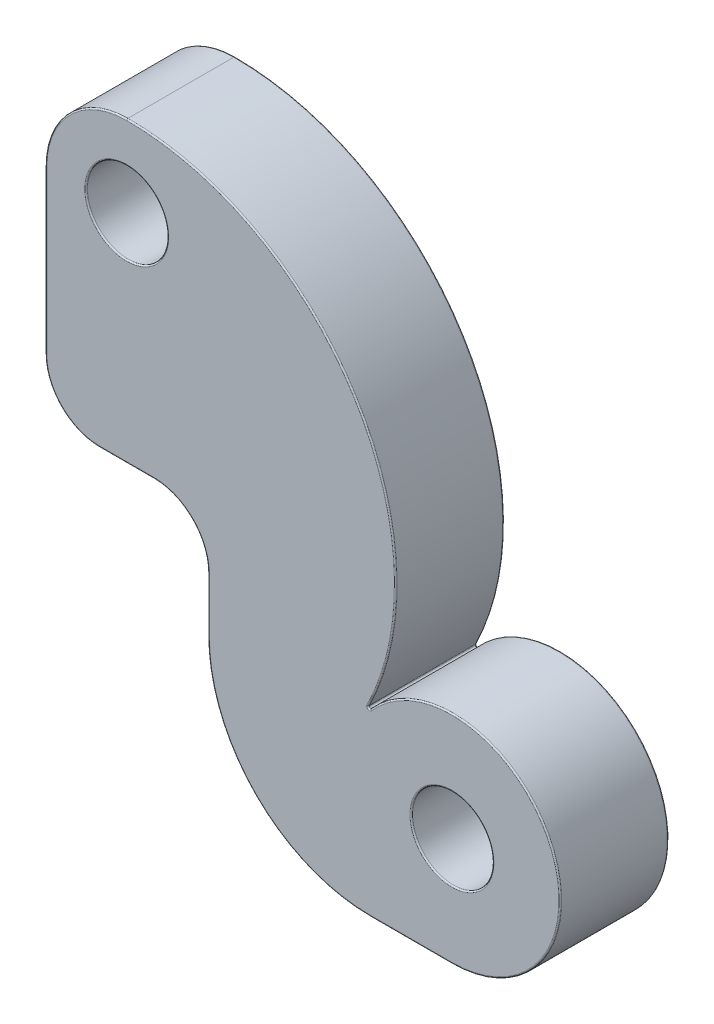
ISO-10303-21;
HEADER;
FILE_DESCRIPTION(('STEP AP214'),'2;1');
FILE_NAME('part.step','',(''),(''),'','','');
FILE_SCHEMA(('AUTOMOTIVE_DESIGN { 1 0 10303 214 1 1 1 1 }'));
ENDSEC;
DATA;
#1=APPLICATION_CONTEXT('core data for automotive mechanical design processes');
#2=APPLICATION_PROTOCOL_DEFINITION('international standard','automotive_design',2000,#1);
#3=PRODUCT_CONTEXT('',#1,'mechanical');
#4=PRODUCT('Part','Part','',(#3));
#5=PRODUCT_RELATED_PRODUCT_CATEGORY('part','',(#4));
#6=PRODUCT_DEFINITION_FORMATION('','',#4);
#7=PRODUCT_DEFINITION_CONTEXT('part definition',#1,'design');
#8=PRODUCT_DEFINITION('design','',#6,#7);
#9=PRODUCT_DEFINITION_SHAPE('','',#8);
#10=(LENGTH_UNIT() NAMED_UNIT(*) SI_UNIT(.MILLI.,.METRE.));
#11=(NAMED_UNIT(*) PLANE_ANGLE_UNIT() SI_UNIT($,.RADIAN.));
#12=(NAMED_UNIT(*) SI_UNIT($,.STERADIAN.) SOLID_ANGLE_UNIT());
#13=UNCERTAINTY_MEASURE_WITH_UNIT(LENGTH_MEASURE(1.E-05),#10,'distance_accuracy_value','');
#14=(GEOMETRIC_REPRESENTATION_CONTEXT(3) GLOBAL_UNCERTAINTY_ASSIGNED_CONTEXT((#13)) GLOBAL_UNIT_ASSIGNED_CONTEXT((#10,
#11,#12)) REPRESENTATION_CONTEXT('',''));
#15=CARTESIAN_POINT('',(0.,0.,0.));
#16=DIRECTION('',(0.,0.,1.));
#17=DIRECTION('',(1.,0.,0.));
#18=AXIS2_PLACEMENT_3D('',#15,#16,#17);
#19=CARTESIAN_POINT('',(0.,0.,20.));
#20=DIRECTION('',(0.,0.,1.));
#21=DIRECTION('',(1.,0.,0.));
#22=AXIS2_PLACEMENT_3D('',#19,#20,#21);
#23=PLANE('',#22);
#24=CARTESIAN_POINT('',(60.,-70.,20.));
#25=DIRECTION('',(0.,0.,1.));
#26=DIRECTION('',(1.,0.,0.));
#27=AXIS2_PLACEMENT_3D('',#24,#25,#26);
#28=CIRCLE('',#27,7.75000000000001);
#29=CARTESIAN_POINT('',(67.75,-70.,20.));
#30=VERTEX_POINT('',#29);
#31=EDGE_CURVE('E394',#30,#30,#28,.F.);
#32=ORIENTED_EDGE('',*,*,#31,.T.);
#33=EDGE_LOOP('',(#32));
#34=FACE_BOUND('',#33,.T.);
#35=CARTESIAN_POINT('',(0.,0.,20.));
#36=DIRECTION('',(0.,0.,1.));
#37=DIRECTION('',(1.,0.,0.));
#38=AXIS2_PLACEMENT_3D('',#35,#36,#37);
#39=CIRCLE('',#38,7.75);
#40=CARTESIAN_POINT('',(7.75,0.,20.));
#41=VERTEX_POINT('',#40);
#42=EDGE_CURVE('E390',#41,#41,#39,.F.);
#43=ORIENTED_EDGE('',*,*,#42,.T.);
#44=EDGE_LOOP('',(#43));
#45=FACE_BOUND('',#44,.T.);
#46=CARTESIAN_POINT('',(60.,-70.,20.));
#47=DIRECTION('',(0.,0.,1.));
#48=DIRECTION('',(1.,0.,0.));
#49=AXIS2_PLACEMENT_3D('',#46,#47,#48);
#50=CIRCLE('',#49,19.75);
#51=CARTESIAN_POINT('',(60.,-89.75,20.));
#52=VERTEX_POINT('',#51);
#53=CARTESIAN_POINT('',(45.1570433548488,-56.9712188586131,20.));
#54=VERTEX_POINT('',#53);
#55=EDGE_CURVE('E235',#52,#54,#50,.T.);
#56=ORIENTED_EDGE('',*,*,#55,.T.);
#57=CARTESIAN_POINT('',(44.7812723005411,-56.6413762980716,20.));
#58=DIRECTION('',(0.,0.,1.));
#59=DIRECTION('',(1.,0.,0.));
#60=AXIS2_PLACEMENT_3D('',#57,#58,#59);
#61=CIRCLE('',#60,0.5);
#62=CARTESIAN_POINT('',(44.3324979181449,-56.4209186973751,20.));
#63=VERTEX_POINT('',#62);
#64=EDGE_CURVE('E11',#54,#63,#61,.F.);
#65=ORIENTED_EDGE('',*,*,#64,.T.);
#66=CARTESIAN_POINT('',(0.,-34.6428571428571,20.));
#67=DIRECTION('',(0.,0.,1.));
#68=DIRECTION('',(1.,0.,0.));
#69=AXIS2_PLACEMENT_3D('',#66,#67,#68);
#70=CIRCLE('',#69,49.3928571428571);
#71=CARTESIAN_POINT('',(0.,14.75,20.));
#72=VERTEX_POINT('',#71);
#73=EDGE_CURVE('E360',#63,#72,#70,.T.);
#74=ORIENTED_EDGE('',*,*,#73,.T.);
#75=CARTESIAN_POINT('',(0.,0.,20.));
#76=DIRECTION('',(0.,0.,1.));
#77=DIRECTION('',(1.,0.,0.));
#78=AXIS2_PLACEMENT_3D('',#75,#76,#77);
#79=CIRCLE('',#78,14.75);
#80=CARTESIAN_POINT('',(-14.75,0.,20.));
#81=VERTEX_POINT('',#80);
#82=EDGE_CURVE('E363',#72,#81,#79,.T.);
#83=ORIENTED_EDGE('',*,*,#82,.T.);
#84=DIRECTION('',(0.,-1.,0.));
#85=VECTOR('',#84,1.);
#86=CARTESIAN_POINT('',(-14.75,-29.9999999999999,20.));
#87=LINE('',#86,#85);
#88=CARTESIAN_POINT('',(-14.75,-29.9999999999999,20.));
#89=VERTEX_POINT('',#88);
#90=EDGE_CURVE('E367',#81,#89,#87,.T.);
#91=ORIENTED_EDGE('',*,*,#90,.T.);
#92=CARTESIAN_POINT('',(-5.,-30.,20.));
#93=DIRECTION('',(0.,0.,1.));
#94=DIRECTION('',(1.,0.,0.));
#95=AXIS2_PLACEMENT_3D('',#92,#93,#94);
#96=CIRCLE('',#95,9.75);
#97=CARTESIAN_POINT('',(-4.99999999999993,-39.75,20.));
#98=VERTEX_POINT('',#97);
#99=EDGE_CURVE('E370',#89,#98,#96,.T.);
#100=ORIENTED_EDGE('',*,*,#99,.T.);
#101=DIRECTION('',(1.,0.,0.));
#102=VECTOR('',#101,1.);
#103=CARTESIAN_POINT('',(4.99999999999994,-39.75,20.));
#104=LINE('',#103,#102);
#105=CARTESIAN_POINT('',(4.99999999999994,-39.75,20.));
#106=VERTEX_POINT('',#105);
#107=EDGE_CURVE('E373',#98,#106,#104,.T.);
#108=ORIENTED_EDGE('',*,*,#107,.T.);
#109=CARTESIAN_POINT('',(5.00000000000001,-50.,20.));
#110=DIRECTION('',(0.,0.,1.));
#111=DIRECTION('',(1.,0.,0.));
#112=AXIS2_PLACEMENT_3D('',#109,#110,#111);
#113=CIRCLE('',#112,10.25);
#114=CARTESIAN_POINT('',(15.25,-50.0000000000001,20.));
#115=VERTEX_POINT('',#114);
#116=EDGE_CURVE('E376',#106,#115,#113,.F.);
#117=ORIENTED_EDGE('',*,*,#116,.T.);
#118=DIRECTION('',(0.,-1.,0.));
#119=VECTOR('',#118,1.);
#120=CARTESIAN_POINT('',(15.25,-59.9999999999998,20.));
#121=LINE('',#120,#119);
#122=CARTESIAN_POINT('',(15.25,-59.9999999999998,20.));
#123=VERTEX_POINT('',#122);
#124=EDGE_CURVE('E379',#115,#123,#121,.T.);
#125=ORIENTED_EDGE('',*,*,#124,.T.);
#126=CARTESIAN_POINT('',(45.,-60.,20.));
#127=DIRECTION('',(0.,0.,1.));
#128=DIRECTION('',(1.,0.,0.));
#129=AXIS2_PLACEMENT_3D('',#126,#127,#128);
#130=CIRCLE('',#129,29.75);
#131=CARTESIAN_POINT('',(45.0000000000002,-89.75,20.));
#132=VERTEX_POINT('',#131);
#133=EDGE_CURVE('E382',#123,#132,#130,.T.);
#134=ORIENTED_EDGE('',*,*,#133,.T.);
#135=DIRECTION('',(1.,0.,0.));
#136=VECTOR('',#135,1.);
#137=CARTESIAN_POINT('',(60.,-89.75,20.));
#138=LINE('',#137,#136);
#139=EDGE_CURVE('E385',#132,#52,#138,.T.);
#140=ORIENTED_EDGE('',*,*,#139,.T.);
#141=EDGE_LOOP('',(#56,#65,#74,#83,#91,#100,#108,#117,#125,#134,#140));
#142=FACE_BOUND('',#141,.T.);
#143=ADVANCED_FACE('F45',(#34,#45,#142),#23,.T.);
#144=CARTESIAN_POINT('',(0.,0.,0.));
#145=DIRECTION('',(0.,0.,1.));
#146=DIRECTION('',(1.,0.,0.));
#147=AXIS2_PLACEMENT_3D('',#144,#145,#146);
#148=PLANE('',#147);
#149=CARTESIAN_POINT('',(60.,-70.,0.));
#150=DIRECTION('',(0.,0.,1.));
#151=DIRECTION('',(1.,0.,0.));
#152=AXIS2_PLACEMENT_3D('',#149,#150,#151);
#153=CIRCLE('',#152,7.75000000000001);
#154=CARTESIAN_POINT('',(67.75,-70.,0.));
#155=VERTEX_POINT('',#154);
#156=EDGE_CURVE('E342',#155,#155,#153,.T.);
#157=ORIENTED_EDGE('',*,*,#156,.T.);
#158=EDGE_LOOP('',(#157));
#159=FACE_BOUND('',#158,.T.);
#160=CARTESIAN_POINT('',(0.,0.,0.));
#161=DIRECTION('',(0.,0.,1.));
#162=DIRECTION('',(1.,0.,0.));
#163=AXIS2_PLACEMENT_3D('',#160,#161,#162);
#164=CIRCLE('',#163,7.75);
#165=CARTESIAN_POINT('',(7.75,0.,0.));
#166=VERTEX_POINT('',#165);
#167=EDGE_CURVE('E338',#166,#166,#164,.T.);
#168=ORIENTED_EDGE('',*,*,#167,.T.);
#169=EDGE_LOOP('',(#168));
#170=FACE_BOUND('',#169,.T.);
#171=CARTESIAN_POINT('',(0.,-34.6428571428571,0.));
#172=DIRECTION('',(0.,0.,1.));
#173=DIRECTION('',(1.,0.,0.));
#174=AXIS2_PLACEMENT_3D('',#171,#172,#173);
#175=CIRCLE('',#174,49.3928571428571);
#176=CARTESIAN_POINT('',(0.,14.75,0.));
#177=VERTEX_POINT('',#176);
#178=CARTESIAN_POINT('',(44.3324979181449,-56.4209186973751,0.));
#179=VERTEX_POINT('',#178);
#180=EDGE_CURVE('E307',#177,#179,#175,.F.);
#181=ORIENTED_EDGE('',*,*,#180,.T.);
#182=CARTESIAN_POINT('',(44.7812723005411,-56.6413762980716,0.));
#183=DIRECTION('',(0.,0.,1.));
#184=DIRECTION('',(1.,0.,0.));
#185=AXIS2_PLACEMENT_3D('',#182,#183,#184);
#186=CIRCLE('',#185,0.5);
#187=CARTESIAN_POINT('',(45.1570433548488,-56.9712188586131,0.));
#188=VERTEX_POINT('',#187);
#189=EDGE_CURVE('E55',#179,#188,#186,.T.);
#190=ORIENTED_EDGE('',*,*,#189,.T.);
#191=CARTESIAN_POINT('',(60.,-70.,0.));
#192=DIRECTION('',(0.,0.,1.));
#193=DIRECTION('',(1.,0.,0.));
#194=AXIS2_PLACEMENT_3D('',#191,#192,#193);
#195=CIRCLE('',#194,19.75);
#196=CARTESIAN_POINT('',(60.,-89.75,0.));
#197=VERTEX_POINT('',#196);
#198=EDGE_CURVE('E335',#188,#197,#195,.F.);
#199=ORIENTED_EDGE('',*,*,#198,.T.);
#200=DIRECTION('',(1.,0.,0.));
#201=VECTOR('',#200,1.);
#202=CARTESIAN_POINT('',(0.,-89.7500000000001,0.));
#203=LINE('',#202,#201);
#204=CARTESIAN_POINT('',(45.0000000000002,-89.75,0.));
#205=VERTEX_POINT('',#204);
#206=EDGE_CURVE('E331',#197,#205,#203,.F.);
#207=ORIENTED_EDGE('',*,*,#206,.T.);
#208=CARTESIAN_POINT('',(45.,-60.,0.));
#209=DIRECTION('',(0.,0.,1.));
#210=DIRECTION('',(1.,0.,0.));
#211=AXIS2_PLACEMENT_3D('',#208,#209,#210);
#212=CIRCLE('',#211,29.75);
#213=CARTESIAN_POINT('',(15.25,-59.9999999999998,0.));
#214=VERTEX_POINT('',#213);
#215=EDGE_CURVE('E328',#205,#214,#212,.F.);
#216=ORIENTED_EDGE('',*,*,#215,.T.);
#217=DIRECTION('',(0.,-1.,0.));
#218=VECTOR('',#217,1.);
#219=CARTESIAN_POINT('',(15.25,0.,0.));
#220=LINE('',#219,#218);
#221=CARTESIAN_POINT('',(15.25,-50.0000000000001,0.));
#222=VERTEX_POINT('',#221);
#223=EDGE_CURVE('E325',#214,#222,#220,.F.);
#224=ORIENTED_EDGE('',*,*,#223,.T.);
#225=CARTESIAN_POINT('',(5.00000000000001,-50.,0.));
#226=DIRECTION('',(0.,0.,1.));
#227=DIRECTION('',(1.,0.,0.));
#228=AXIS2_PLACEMENT_3D('',#225,#226,#227);
#229=CIRCLE('',#228,10.25);
#230=CARTESIAN_POINT('',(4.99999999999994,-39.75,0.));
#231=VERTEX_POINT('',#230);
#232=EDGE_CURVE('E322',#222,#231,#229,.T.);
#233=ORIENTED_EDGE('',*,*,#232,.T.);
#234=DIRECTION('',(1.,0.,0.));
#235=VECTOR('',#234,1.);
#236=CARTESIAN_POINT('',(0.,-39.75,0.));
#237=LINE('',#236,#235);
#238=CARTESIAN_POINT('',(-4.99999999999993,-39.75,0.));
#239=VERTEX_POINT('',#238);
#240=EDGE_CURVE('E319',#231,#239,#237,.F.);
#241=ORIENTED_EDGE('',*,*,#240,.T.);
#242=CARTESIAN_POINT('',(-5.,-30.,0.));
#243=DIRECTION('',(0.,0.,1.));
#244=DIRECTION('',(1.,0.,0.));
#245=AXIS2_PLACEMENT_3D('',#242,#243,#244);
#246=CIRCLE('',#245,9.75);
#247=CARTESIAN_POINT('',(-14.75,-29.9999999999999,0.));
#248=VERTEX_POINT('',#247);
#249=EDGE_CURVE('E316',#239,#248,#246,.F.);
#250=ORIENTED_EDGE('',*,*,#249,.T.);
#251=DIRECTION('',(0.,-1.,0.));
#252=VECTOR('',#251,1.);
#253=CARTESIAN_POINT('',(-14.75,0.,0.));
#254=LINE('',#253,#252);
#255=CARTESIAN_POINT('',(-14.75,0.,0.));
#256=VERTEX_POINT('',#255);
#257=EDGE_CURVE('E313',#248,#256,#254,.F.);
#258=ORIENTED_EDGE('',*,*,#257,.T.);
#259=CARTESIAN_POINT('',(0.,0.,0.));
#260=DIRECTION('',(0.,0.,1.));
#261=DIRECTION('',(1.,0.,0.));
#262=AXIS2_PLACEMENT_3D('',#259,#260,#261);
#263=CIRCLE('',#262,14.75);
#264=EDGE_CURVE('E310',#256,#177,#263,.F.);
#265=ORIENTED_EDGE('',*,*,#264,.T.);
#266=EDGE_LOOP('',(#181,#190,#199,#207,#216,#224,#233,#241,#250,#258,#265));
#267=FACE_BOUND('',#266,.T.);
#268=ADVANCED_FACE('F582',(#159,#170,#267),#148,.F.);
#269=CARTESIAN_POINT('',(0.,0.,20.));
#270=DIRECTION('',(0.,0.,-1.));
#271=DIRECTION('',(-1.,0.,0.));
#272=AXIS2_PLACEMENT_3D('',#269,#270,#271);
#273=CYLINDRICAL_SURFACE('',#272,15.);
#274=DIRECTION('',(0.,0.,-1.));
#275=VECTOR('',#274,1.);
#276=CARTESIAN_POINT('',(0.,15.,20.));
#277=LINE('',#276,#275);
#278=CARTESIAN_POINT('',(0.,15.,19.75));
#279=VERTEX_POINT('',#278);
#280=CARTESIAN_POINT('',(0.,15.,0.25));
#281=VERTEX_POINT('',#280);
#282=EDGE_CURVE('E220',#279,#281,#277,.T.);
#283=ORIENTED_EDGE('',*,*,#282,.T.);
#284=CARTESIAN_POINT('',(0.,0.,0.25));
#285=DIRECTION('',(0.,0.,1.));
#286=DIRECTION('',(1.,0.,0.));
#287=AXIS2_PLACEMENT_3D('',#284,#285,#286);
#288=CIRCLE('',#287,15.);
#289=CARTESIAN_POINT('',(-15.,0.,0.25));
#290=VERTEX_POINT('',#289);
#291=EDGE_CURVE('E409',#281,#290,#288,.T.);
#292=ORIENTED_EDGE('',*,*,#291,.T.);
#293=DIRECTION('',(0.,0.,-1.));
#294=VECTOR('',#293,1.);
#295=CARTESIAN_POINT('',(-15.,0.,20.));
#296=LINE('',#295,#294);
#297=CARTESIAN_POINT('',(-15.,0.,19.75));
#298=VERTEX_POINT('',#297);
#299=EDGE_CURVE('E232',#298,#290,#296,.T.);
#300=ORIENTED_EDGE('',*,*,#299,.F.);
#301=CARTESIAN_POINT('',(0.,0.,19.75));
#302=DIRECTION('',(0.,0.,1.));
#303=DIRECTION('',(1.,0.,0.));
#304=AXIS2_PLACEMENT_3D('',#301,#302,#303);
#305=CIRCLE('',#304,15.);
#306=EDGE_CURVE('E406',#298,#279,#305,.F.);
#307=ORIENTED_EDGE('',*,*,#306,.T.);
#308=EDGE_LOOP('',(#283,#292,#300,#307));
#309=FACE_BOUND('',#308,.T.);
#310=ADVANCED_FACE('F540',(#309),#273,.T.);
#311=CARTESIAN_POINT('',(-15.,0.,20.));
#312=DIRECTION('',(1.,0.,0.));
#313=DIRECTION('',(0.,1.,0.));
#314=AXIS2_PLACEMENT_3D('',#311,#312,#313);
#315=PLANE('',#314);
#316=ORIENTED_EDGE('',*,*,#299,.T.);
#317=DIRECTION('',(0.,-1.,0.));
#318=VECTOR('',#317,1.);
#319=CARTESIAN_POINT('',(-15.,0.,0.25));
#320=LINE('',#319,#318);
#321=CARTESIAN_POINT('',(-15.,-29.9999999999999,0.25));
#322=VERTEX_POINT('',#321);
#323=EDGE_CURVE('E415',#290,#322,#320,.T.);
#324=ORIENTED_EDGE('',*,*,#323,.T.);
#325=DIRECTION('',(0.,0.,-1.));
#326=VECTOR('',#325,1.);
#327=CARTESIAN_POINT('',(-15.,-29.9999999999999,20.));
#328=LINE('',#327,#326);
#329=CARTESIAN_POINT('',(-15.,-29.9999999999999,19.75));
#330=VERTEX_POINT('',#329);
#331=EDGE_CURVE('E298',#330,#322,#328,.T.);
#332=ORIENTED_EDGE('',*,*,#331,.F.);
#333=DIRECTION('',(0.,-1.,0.));
#334=VECTOR('',#333,1.);
#335=CARTESIAN_POINT('',(-15.,0.,19.75));
#336=LINE('',#335,#334);
#337=EDGE_CURVE('E412',#330,#298,#336,.F.);
#338=ORIENTED_EDGE('',*,*,#337,.T.);
#339=EDGE_LOOP('',(#316,#324,#332,#338));
#340=FACE_BOUND('',#339,.T.);
#341=ADVANCED_FACE('F537',(#340),#315,.F.);
#342=CARTESIAN_POINT('',(-5.,-30.,20.));
#343=DIRECTION('',(0.,0.,-1.));
#344=DIRECTION('',(-1.,0.,0.));
#345=AXIS2_PLACEMENT_3D('',#342,#343,#344);
#346=CYLINDRICAL_SURFACE('',#345,10.);
#347=ORIENTED_EDGE('',*,*,#331,.T.);
#348=CARTESIAN_POINT('',(-5.,-30.,0.25));
#349=DIRECTION('',(0.,0.,1.));
#350=DIRECTION('',(1.,0.,0.));
#351=AXIS2_PLACEMENT_3D('',#348,#349,#350);
#352=CIRCLE('',#351,10.);
#353=CARTESIAN_POINT('',(-4.99999999999993,-40.,0.25));
#354=VERTEX_POINT('',#353);
#355=EDGE_CURVE('E421',#322,#354,#352,.T.);
#356=ORIENTED_EDGE('',*,*,#355,.T.);
#357=DIRECTION('',(0.,0.,-1.));
#358=VECTOR('',#357,1.);
#359=CARTESIAN_POINT('',(-4.99999999999993,-40.,20.));
#360=LINE('',#359,#358);
#361=CARTESIAN_POINT('',(-4.99999999999993,-40.,19.75));
#362=VERTEX_POINT('',#361);
#363=EDGE_CURVE('E294',#362,#354,#360,.T.);
#364=ORIENTED_EDGE('',*,*,#363,.F.);
#365=CARTESIAN_POINT('',(-5.,-30.,19.75));
#366=DIRECTION('',(0.,0.,1.));
#367=DIRECTION('',(1.,0.,0.));
#368=AXIS2_PLACEMENT_3D('',#365,#366,#367);
#369=CIRCLE('',#368,10.);
#370=EDGE_CURVE('E418',#362,#330,#369,.F.);
#371=ORIENTED_EDGE('',*,*,#370,.T.);
#372=EDGE_LOOP('',(#347,#356,#364,#371));
#373=FACE_BOUND('',#372,.T.);
#374=ADVANCED_FACE('F523',(#373),#346,.T.);
#375=CARTESIAN_POINT('',(-4.99999999999992,-40.,20.));
#376=DIRECTION('',(0.,1.,0.));
#377=DIRECTION('',(0.,0.,1.));
#378=AXIS2_PLACEMENT_3D('',#375,#376,#377);
#379=PLANE('',#378);
#380=ORIENTED_EDGE('',*,*,#363,.T.);
#381=DIRECTION('',(1.,0.,0.));
#382=VECTOR('',#381,1.);
#383=CARTESIAN_POINT('',(-4.99999999999992,-40.,0.25));
#384=LINE('',#383,#382);
#385=CARTESIAN_POINT('',(4.99999999999994,-40.,0.25));
#386=VERTEX_POINT('',#385);
#387=EDGE_CURVE('E349',#354,#386,#384,.T.);
#388=ORIENTED_EDGE('',*,*,#387,.T.);
#389=DIRECTION('',(0.,0.,-1.));
#390=VECTOR('',#389,1.);
#391=CARTESIAN_POINT('',(4.99999999999994,-40.,20.));
#392=LINE('',#391,#390);
#393=CARTESIAN_POINT('',(4.99999999999994,-40.,19.75));
#394=VERTEX_POINT('',#393);
#395=EDGE_CURVE('E290',#394,#386,#392,.T.);
#396=ORIENTED_EDGE('',*,*,#395,.F.);
#397=DIRECTION('',(1.,0.,0.));
#398=VECTOR('',#397,1.);
#399=CARTESIAN_POINT('',(-4.99999999999993,-40.,19.75));
#400=LINE('',#399,#398);
#401=EDGE_CURVE('E346',#394,#362,#400,.F.);
#402=ORIENTED_EDGE('',*,*,#401,.T.);
#403=EDGE_LOOP('',(#380,#388,#396,#402));
#404=FACE_BOUND('',#403,.T.);
#405=ADVANCED_FACE('F527',(#404),#379,.F.);
#406=CARTESIAN_POINT('',(5.00000000000001,-50.,20.));
#407=DIRECTION('',(0.,0.,-1.));
#408=DIRECTION('',(-1.,0.,0.));
#409=AXIS2_PLACEMENT_3D('',#406,#407,#408);
#410=CYLINDRICAL_SURFACE('',#409,10.);
#411=ORIENTED_EDGE('',*,*,#395,.T.);
#412=CARTESIAN_POINT('',(5.00000000000001,-50.,0.25));
#413=DIRECTION('',(0.,0.,1.));
#414=DIRECTION('',(1.,0.,0.));
#415=AXIS2_PLACEMENT_3D('',#412,#413,#414);
#416=CIRCLE('',#415,10.);
#417=CARTESIAN_POINT('',(15.,-50.0000000000001,0.25));
#418=VERTEX_POINT('',#417);
#419=EDGE_CURVE('E427',#386,#418,#416,.F.);
#420=ORIENTED_EDGE('',*,*,#419,.T.);
#421=DIRECTION('',(0.,0.,-1.));
#422=VECTOR('',#421,1.);
#423=CARTESIAN_POINT('',(15.,-50.0000000000001,20.));
#424=LINE('',#423,#422);
#425=CARTESIAN_POINT('',(15.,-50.0000000000001,19.75));
#426=VERTEX_POINT('',#425);
#427=EDGE_CURVE('E286',#426,#418,#424,.T.);
#428=ORIENTED_EDGE('',*,*,#427,.F.);
#429=CARTESIAN_POINT('',(5.00000000000001,-50.,19.75));
#430=DIRECTION('',(0.,0.,1.));
#431=DIRECTION('',(1.,0.,0.));
#432=AXIS2_PLACEMENT_3D('',#429,#430,#431);
#433=CIRCLE('',#432,10.);
#434=EDGE_CURVE('E424',#426,#394,#433,.T.);
#435=ORIENTED_EDGE('',*,*,#434,.T.);
#436=EDGE_LOOP('',(#411,#420,#428,#435));
#437=FACE_BOUND('',#436,.T.);
#438=ADVANCED_FACE('F687',(#437),#410,.F.);
#439=CARTESIAN_POINT('',(15.,-50.0000000000001,20.));
#440=DIRECTION('',(1.,0.,0.));
#441=DIRECTION('',(0.,1.,0.));
#442=AXIS2_PLACEMENT_3D('',#439,#440,#441);
#443=PLANE('',#442);
#444=ORIENTED_EDGE('',*,*,#427,.T.);
#445=DIRECTION('',(0.,-1.,0.));
#446=VECTOR('',#445,1.);
#447=CARTESIAN_POINT('',(15.,-50.0000000000001,0.25));
#448=LINE('',#447,#446);
#449=CARTESIAN_POINT('',(15.,-59.9999999999998,0.25));
#450=VERTEX_POINT('',#449);
#451=EDGE_CURVE('E433',#418,#450,#448,.T.);
#452=ORIENTED_EDGE('',*,*,#451,.T.);
#453=DIRECTION('',(0.,0.,-1.));
#454=VECTOR('',#453,1.);
#455=CARTESIAN_POINT('',(15.,-59.9999999999998,20.));
#456=LINE('',#455,#454);
#457=CARTESIAN_POINT('',(15.,-59.9999999999998,19.75));
#458=VERTEX_POINT('',#457);
#459=EDGE_CURVE('E282',#458,#450,#456,.T.);
#460=ORIENTED_EDGE('',*,*,#459,.F.);
#461=DIRECTION('',(0.,-1.,0.));
#462=VECTOR('',#461,1.);
#463=CARTESIAN_POINT('',(15.,-50.0000000000001,19.75));
#464=LINE('',#463,#462);
#465=EDGE_CURVE('E430',#458,#426,#464,.F.);
#466=ORIENTED_EDGE('',*,*,#465,.T.);
#467=EDGE_LOOP('',(#444,#452,#460,#466));
#468=FACE_BOUND('',#467,.T.);
#469=ADVANCED_FACE('F690',(#468),#443,.F.);
#470=CARTESIAN_POINT('',(45.,-60.,20.));
#471=DIRECTION('',(0.,0.,-1.));
#472=DIRECTION('',(-1.,0.,0.));
#473=AXIS2_PLACEMENT_3D('',#470,#471,#472);
#474=CYLINDRICAL_SURFACE('',#473,30.);
#475=ORIENTED_EDGE('',*,*,#459,.T.);
#476=CARTESIAN_POINT('',(45.,-60.,0.25));
#477=DIRECTION('',(0.,0.,1.));
#478=DIRECTION('',(1.,0.,0.));
#479=AXIS2_PLACEMENT_3D('',#476,#477,#478);
#480=CIRCLE('',#479,30.);
#481=CARTESIAN_POINT('',(45.0000000000002,-90.,0.25));
#482=VERTEX_POINT('',#481);
#483=EDGE_CURVE('E439',#450,#482,#480,.T.);
#484=ORIENTED_EDGE('',*,*,#483,.T.);
#485=DIRECTION('',(0.,0.,-1.));
#486=VECTOR('',#485,1.);
#487=CARTESIAN_POINT('',(45.0000000000002,-90.,20.));
#488=LINE('',#487,#486);
#489=CARTESIAN_POINT('',(45.0000000000002,-90.,19.75));
#490=VERTEX_POINT('',#489);
#491=EDGE_CURVE('E219',#490,#482,#488,.T.);
#492=ORIENTED_EDGE('',*,*,#491,.F.);
#493=CARTESIAN_POINT('',(45.,-60.,19.75));
#494=DIRECTION('',(0.,0.,1.));
#495=DIRECTION('',(1.,0.,0.));
#496=AXIS2_PLACEMENT_3D('',#493,#494,#495);
#497=CIRCLE('',#496,30.);
#498=EDGE_CURVE('E436',#490,#458,#497,.F.);
#499=ORIENTED_EDGE('',*,*,#498,.T.);
#500=EDGE_LOOP('',(#475,#484,#492,#499));
#501=FACE_BOUND('',#500,.T.);
#502=ADVANCED_FACE('F694',(#501),#474,.T.);
#503=CARTESIAN_POINT('',(60.,-90.,20.));
#504=DIRECTION('',(0.,1.,0.));
#505=DIRECTION('',(-1.,0.,0.));
#506=AXIS2_PLACEMENT_3D('',#503,#504,#505);
#507=PLANE('',#506);
#508=ORIENTED_EDGE('',*,*,#491,.T.);
#509=DIRECTION('',(1.,0.,0.));
#510=VECTOR('',#509,1.);
#511=CARTESIAN_POINT('',(60.,-90.,0.25));
#512=LINE('',#511,#510);
#513=CARTESIAN_POINT('',(60.,-90.,0.25));
#514=VERTEX_POINT('',#513);
#515=EDGE_CURVE('E217',#482,#514,#512,.T.);
#516=ORIENTED_EDGE('',*,*,#515,.T.);
#517=DIRECTION('',(0.,0.,-1.));
#518=VECTOR('',#517,1.);
#519=CARTESIAN_POINT('',(60.,-90.,20.));
#520=LINE('',#519,#518);
#521=CARTESIAN_POINT('',(60.,-90.,19.75));
#522=VERTEX_POINT('',#521);
#523=EDGE_CURVE('E199',#522,#514,#520,.T.);
#524=ORIENTED_EDGE('',*,*,#523,.F.);
#525=DIRECTION('',(1.,0.,0.));
#526=VECTOR('',#525,1.);
#527=CARTESIAN_POINT('',(45.0000000000002,-90.,19.75));
#528=LINE('',#527,#526);
#529=EDGE_CURVE('E214',#522,#490,#528,.F.);
#530=ORIENTED_EDGE('',*,*,#529,.T.);
#531=EDGE_LOOP('',(#508,#516,#524,#530));
#532=FACE_BOUND('',#531,.T.);
#533=ADVANCED_FACE('F213',(#532),#507,.F.);
#534=CARTESIAN_POINT('',(60.,-70.,20.));
#535=DIRECTION('',(0.,0.,-1.));
#536=DIRECTION('',(-1.,0.,0.));
#537=AXIS2_PLACEMENT_3D('',#534,#535,#536);
#538=CYLINDRICAL_SURFACE('',#537,20.);
#539=ORIENTED_EDGE('',*,*,#523,.T.);
#540=CARTESIAN_POINT('',(60.,-70.,0.25));
#541=DIRECTION('',(0.,0.,1.));
#542=DIRECTION('',(1.,0.,0.));
#543=AXIS2_PLACEMENT_3D('',#540,#541,#542);
#544=CIRCLE('',#543,20.);
#545=CARTESIAN_POINT('',(44.9691578276949,-56.8062975783423,0.25));
#546=VERTEX_POINT('',#545);
#547=EDGE_CURVE('E207',#514,#546,#544,.T.);
#548=ORIENTED_EDGE('',*,*,#547,.T.);
#549=DIRECTION('',(0.,0.,-1.));
#550=VECTOR('',#549,1.);
#551=CARTESIAN_POINT('',(44.9691578276949,-56.8062975783423,20.));
#552=LINE('',#551,#550);
#553=CARTESIAN_POINT('',(44.9691578276949,-56.8062975783423,19.75));
#554=VERTEX_POINT('',#553);
#555=EDGE_CURVE('E201',#546,#554,#552,.F.);
#556=ORIENTED_EDGE('',*,*,#555,.T.);
#557=CARTESIAN_POINT('',(60.,-70.,19.75));
#558=DIRECTION('',(0.,0.,1.));
#559=DIRECTION('',(1.,0.,0.));
#560=AXIS2_PLACEMENT_3D('',#557,#558,#559);
#561=CIRCLE('',#560,20.);
#562=EDGE_CURVE('E196',#554,#522,#561,.F.);
#563=ORIENTED_EDGE('',*,*,#562,.T.);
#564=EDGE_LOOP('',(#539,#548,#556,#563));
#565=FACE_BOUND('',#564,.T.);
#566=ADVANCED_FACE('F198',(#565),#538,.T.);
#567=CARTESIAN_POINT('',(0.,-34.6428571428571,20.));
#568=DIRECTION('',(0.,0.,-1.));
#569=DIRECTION('',(-1.,0.,0.));
#570=AXIS2_PLACEMENT_3D('',#567,#568,#569);
#571=CYLINDRICAL_SURFACE('',#570,49.6428571428571);
#572=DIRECTION('',(0.,0.,-1.));
#573=VECTOR('',#572,1.);
#574=CARTESIAN_POINT('',(44.556885109343,-56.5311474977234,20.));
#575=LINE('',#574,#573);
#576=CARTESIAN_POINT('',(44.556885109343,-56.5311474977234,19.75));
#577=VERTEX_POINT('',#576);
#578=CARTESIAN_POINT('',(44.556885109343,-56.5311474977234,0.25));
#579=VERTEX_POINT('',#578);
#580=EDGE_CURVE('E63',#577,#579,#575,.T.);
#581=ORIENTED_EDGE('',*,*,#580,.T.);
#582=CARTESIAN_POINT('',(0.,-34.6428571428571,0.25));
#583=DIRECTION('',(0.,0.,1.));
#584=DIRECTION('',(1.,0.,0.));
#585=AXIS2_PLACEMENT_3D('',#582,#583,#584);
#586=CIRCLE('',#585,49.6428571428571);
#587=EDGE_CURVE('E450',#579,#281,#586,.T.);
#588=ORIENTED_EDGE('',*,*,#587,.T.);
#589=ORIENTED_EDGE('',*,*,#282,.F.);
#590=CARTESIAN_POINT('',(0.,-34.6428571428571,19.75));
#591=DIRECTION('',(0.,0.,1.));
#592=DIRECTION('',(1.,0.,0.));
#593=AXIS2_PLACEMENT_3D('',#590,#591,#592);
#594=CIRCLE('',#593,49.6428571428571);
#595=EDGE_CURVE('E68',#279,#577,#594,.F.);
#596=ORIENTED_EDGE('',*,*,#595,.T.);
#597=EDGE_LOOP('',(#581,#588,#589,#596));
#598=FACE_BOUND('',#597,.T.);
#599=ADVANCED_FACE('F568',(#598),#571,.T.);
#600=CARTESIAN_POINT('',(0.,0.,20.));
#601=DIRECTION('',(0.,0.,-1.));
#602=DIRECTION('',(-1.,0.,0.));
#603=AXIS2_PLACEMENT_3D('',#600,#601,#602);
#604=CYLINDRICAL_SURFACE('',#603,7.5);
#605=CARTESIAN_POINT('',(0.,0.,0.25));
#606=DIRECTION('',(0.,0.,1.));
#607=DIRECTION('',(1.,0.,0.));
#608=AXIS2_PLACEMENT_3D('',#605,#606,#607);
#609=CIRCLE('',#608,7.5);
#610=CARTESIAN_POINT('',(7.5,0.,0.25));
#611=VERTEX_POINT('',#610);
#612=EDGE_CURVE('E402',#611,#611,#609,.F.);
#613=ORIENTED_EDGE('',*,*,#612,.T.);
#614=EDGE_LOOP('',(#613));
#615=FACE_BOUND('',#614,.T.);
#616=CARTESIAN_POINT('',(0.,0.,19.75));
#617=DIRECTION('',(0.,0.,1.));
#618=DIRECTION('',(1.,0.,0.));
#619=AXIS2_PLACEMENT_3D('',#616,#617,#618);
#620=CIRCLE('',#619,7.5);
#621=CARTESIAN_POINT('',(7.5,0.,19.75));
#622=VERTEX_POINT('',#621);
#623=EDGE_CURVE('E398',#622,#622,#620,.T.);
#624=ORIENTED_EDGE('',*,*,#623,.T.);
#625=EDGE_LOOP('',(#624));
#626=FACE_BOUND('',#625,.T.);
#627=ADVANCED_FACE('F570',(#615,#626),#604,.F.);
#628=CARTESIAN_POINT('',(60.,-70.,20.));
#629=DIRECTION('',(0.,0.,-1.));
#630=DIRECTION('',(-1.,0.,0.));
#631=AXIS2_PLACEMENT_3D('',#628,#629,#630);
#632=CYLINDRICAL_SURFACE('',#631,7.50000000000001);
#633=CARTESIAN_POINT('',(60.,-70.,0.25));
#634=DIRECTION('',(0.,0.,1.));
#635=DIRECTION('',(1.,0.,0.));
#636=AXIS2_PLACEMENT_3D('',#633,#634,#635);
#637=CIRCLE('',#636,7.50000000000001);
#638=CARTESIAN_POINT('',(67.5,-70.,0.25));
#639=VERTEX_POINT('',#638);
#640=EDGE_CURVE('E356',#639,#639,#637,.F.);
#641=ORIENTED_EDGE('',*,*,#640,.T.);
#642=EDGE_LOOP('',(#641));
#643=FACE_BOUND('',#642,.T.);
#644=CARTESIAN_POINT('',(60.,-70.,19.75));
#645=DIRECTION('',(0.,0.,1.));
#646=DIRECTION('',(1.,0.,0.));
#647=AXIS2_PLACEMENT_3D('',#644,#645,#646);
#648=CIRCLE('',#647,7.50000000000001);
#649=CARTESIAN_POINT('',(67.5,-70.,19.75));
#650=VERTEX_POINT('',#649);
#651=EDGE_CURVE('E352',#650,#650,#648,.T.);
#652=ORIENTED_EDGE('',*,*,#651,.T.);
#653=EDGE_LOOP('',(#652));
#654=FACE_BOUND('',#653,.T.);
#655=ADVANCED_FACE('F576',(#643,#654),#632,.F.);
#656=CARTESIAN_POINT('',(5.00000000000001,-50.,19.75));
#657=DIRECTION('',(0.,0.,1.));
#658=DIRECTION('',(1.,0.,0.));
#659=AXIS2_PLACEMENT_3D('',#656,#657,#658);
#660=TOROIDAL_SURFACE('',#659,10.25,0.25);
#661=CARTESIAN_POINT('',(15.25,-50.0000000000001,19.75));
#662=DIRECTION('',(0.,-1.,0.));
#663=DIRECTION('',(0.,0.,-1.));
#664=AXIS2_PLACEMENT_3D('',#661,#662,#663);
#665=CIRCLE('',#664,0.25);
#666=EDGE_CURVE('E261',#115,#426,#665,.T.);
#667=ORIENTED_EDGE('',*,*,#666,.F.);
#668=ORIENTED_EDGE('',*,*,#116,.F.);
#669=CARTESIAN_POINT('',(4.99999999999993,-39.75,19.75));
#670=DIRECTION('',(-1.,0.,0.));
#671=DIRECTION('',(0.,0.,1.));
#672=AXIS2_PLACEMENT_3D('',#669,#670,#671);
#673=CIRCLE('',#672,0.25);
#674=EDGE_CURVE('E49',#394,#106,#673,.T.);
#675=ORIENTED_EDGE('',*,*,#674,.F.);
#676=ORIENTED_EDGE('',*,*,#434,.F.);
#677=EDGE_LOOP('',(#667,#668,#675,#676));
#678=FACE_BOUND('',#677,.T.);
#679=ADVANCED_FACE('F592',(#678),#660,.T.);
#680=CARTESIAN_POINT('',(0.,-39.75,19.75));
#681=DIRECTION('',(-1.,0.,0.));
#682=DIRECTION('',(0.,0.,1.));
#683=AXIS2_PLACEMENT_3D('',#680,#681,#682);
#684=CYLINDRICAL_SURFACE('',#683,0.25);
#685=ORIENTED_EDGE('',*,*,#674,.T.);
#686=ORIENTED_EDGE('',*,*,#107,.F.);
#687=CARTESIAN_POINT('',(-4.99999999999993,-39.75,19.75));
#688=DIRECTION('',(-1.,0.,0.));
#689=DIRECTION('',(0.,0.,1.));
#690=AXIS2_PLACEMENT_3D('',#687,#688,#689);
#691=CIRCLE('',#690,0.25);
#692=EDGE_CURVE('E258',#362,#98,#691,.T.);
#693=ORIENTED_EDGE('',*,*,#692,.F.);
#694=ORIENTED_EDGE('',*,*,#401,.F.);
#695=EDGE_LOOP('',(#685,#686,#693,#694));
#696=FACE_BOUND('',#695,.T.);
#697=ADVANCED_FACE('F529',(#696),#684,.T.);
#698=CARTESIAN_POINT('',(15.25,0.,19.75));
#699=DIRECTION('',(0.,1.,0.));
#700=DIRECTION('',(-1.,0.,0.));
#701=AXIS2_PLACEMENT_3D('',#698,#699,#700);
#702=CYLINDRICAL_SURFACE('',#701,0.25);
#703=ORIENTED_EDGE('',*,*,#666,.T.);
#704=ORIENTED_EDGE('',*,*,#465,.F.);
#705=CARTESIAN_POINT('',(15.25,-59.9999999999998,19.75));
#706=DIRECTION('',(0.,-1.,0.));
#707=DIRECTION('',(0.,0.,-1.));
#708=AXIS2_PLACEMENT_3D('',#705,#706,#707);
#709=CIRCLE('',#708,0.25);
#710=EDGE_CURVE('E254',#123,#458,#709,.T.);
#711=ORIENTED_EDGE('',*,*,#710,.F.);
#712=ORIENTED_EDGE('',*,*,#124,.F.);
#713=EDGE_LOOP('',(#703,#704,#711,#712));
#714=FACE_BOUND('',#713,.T.);
#715=ADVANCED_FACE('F621',(#714),#702,.T.);
#716=CARTESIAN_POINT('',(-5.,-30.,19.75));
#717=DIRECTION('',(0.,0.,1.));
#718=DIRECTION('',(1.,0.,0.));
#719=AXIS2_PLACEMENT_3D('',#716,#717,#718);
#720=TOROIDAL_SURFACE('',#719,9.75,0.25);
#721=ORIENTED_EDGE('',*,*,#692,.T.);
#722=ORIENTED_EDGE('',*,*,#99,.F.);
#723=CARTESIAN_POINT('',(-14.75,-29.9999999999999,19.75));
#724=DIRECTION('',(0.,1.,0.));
#725=DIRECTION('',(0.,0.,1.));
#726=AXIS2_PLACEMENT_3D('',#723,#724,#725);
#727=CIRCLE('',#726,0.25);
#728=EDGE_CURVE('E250',#330,#89,#727,.T.);
#729=ORIENTED_EDGE('',*,*,#728,.F.);
#730=ORIENTED_EDGE('',*,*,#370,.F.);
#731=EDGE_LOOP('',(#721,#722,#729,#730));
#732=FACE_BOUND('',#731,.T.);
#733=ADVANCED_FACE('F534',(#732),#720,.T.);
#734=CARTESIAN_POINT('',(45.,-60.,19.75));
#735=DIRECTION('',(0.,0.,1.));
#736=DIRECTION('',(1.,0.,0.));
#737=AXIS2_PLACEMENT_3D('',#734,#735,#736);
#738=TOROIDAL_SURFACE('',#737,29.75,0.25);
#739=ORIENTED_EDGE('',*,*,#710,.T.);
#740=ORIENTED_EDGE('',*,*,#498,.F.);
#741=CARTESIAN_POINT('',(45.0000000000002,-89.75,19.75));
#742=DIRECTION('',(1.,0.,0.));
#743=DIRECTION('',(0.,0.,-1.));
#744=AXIS2_PLACEMENT_3D('',#741,#742,#743);
#745=CIRCLE('',#744,0.25);
#746=EDGE_CURVE('E230',#132,#490,#745,.T.);
#747=ORIENTED_EDGE('',*,*,#746,.F.);
#748=ORIENTED_EDGE('',*,*,#133,.F.);
#749=EDGE_LOOP('',(#739,#740,#747,#748));
#750=FACE_BOUND('',#749,.T.);
#751=ADVANCED_FACE('F626',(#750),#738,.T.);
#752=CARTESIAN_POINT('',(-14.75,0.,19.75));
#753=DIRECTION('',(0.,1.,0.));
#754=DIRECTION('',(-1.,0.,0.));
#755=AXIS2_PLACEMENT_3D('',#752,#753,#754);
#756=CYLINDRICAL_SURFACE('',#755,0.25);
#757=ORIENTED_EDGE('',*,*,#728,.T.);
#758=ORIENTED_EDGE('',*,*,#90,.F.);
#759=CARTESIAN_POINT('',(-14.75,0.,19.75));
#760=DIRECTION('',(0.,1.,0.));
#761=DIRECTION('',(0.,0.,1.));
#762=AXIS2_PLACEMENT_3D('',#759,#760,#761);
#763=CIRCLE('',#762,0.25);
#764=EDGE_CURVE('E237',#298,#81,#763,.T.);
#765=ORIENTED_EDGE('',*,*,#764,.F.);
#766=ORIENTED_EDGE('',*,*,#337,.F.);
#767=EDGE_LOOP('',(#757,#758,#765,#766));
#768=FACE_BOUND('',#767,.T.);
#769=ADVANCED_FACE('F544',(#768),#756,.T.);
#770=CARTESIAN_POINT('',(0.,-89.7500000000001,19.75));
#771=DIRECTION('',(-1.,0.,0.));
#772=DIRECTION('',(0.,-1.,0.));
#773=AXIS2_PLACEMENT_3D('',#770,#771,#772);
#774=CYLINDRICAL_SURFACE('',#773,0.25);
#775=ORIENTED_EDGE('',*,*,#746,.T.);
#776=ORIENTED_EDGE('',*,*,#529,.F.);
#777=CARTESIAN_POINT('',(60.,-89.75,19.75));
#778=DIRECTION('',(1.,0.,0.));
#779=DIRECTION('',(0.,0.,-1.));
#780=AXIS2_PLACEMENT_3D('',#777,#778,#779);
#781=CIRCLE('',#780,0.25);
#782=EDGE_CURVE('E227',#52,#522,#781,.T.);
#783=ORIENTED_EDGE('',*,*,#782,.F.);
#784=ORIENTED_EDGE('',*,*,#139,.F.);
#785=EDGE_LOOP('',(#775,#776,#783,#784));
#786=FACE_BOUND('',#785,.T.);
#787=ADVANCED_FACE('F225',(#786),#774,.T.);
#788=CARTESIAN_POINT('',(0.,0.,19.75));
#789=DIRECTION('',(0.,0.,1.));
#790=DIRECTION('',(1.,0.,0.));
#791=AXIS2_PLACEMENT_3D('',#788,#789,#790);
#792=TOROIDAL_SURFACE('',#791,14.75,0.25);
#793=ORIENTED_EDGE('',*,*,#764,.T.);
#794=ORIENTED_EDGE('',*,*,#82,.F.);
#795=CARTESIAN_POINT('',(0.,14.75,19.75));
#796=DIRECTION('',(1.,0.,0.));
#797=DIRECTION('',(0.,1.,0.));
#798=AXIS2_PLACEMENT_3D('',#795,#796,#797);
#799=CIRCLE('',#798,0.25);
#800=EDGE_CURVE('E238',#279,#72,#799,.T.);
#801=ORIENTED_EDGE('',*,*,#800,.F.);
#802=ORIENTED_EDGE('',*,*,#306,.F.);
#803=EDGE_LOOP('',(#793,#794,#801,#802));
#804=FACE_BOUND('',#803,.T.);
#805=ADVANCED_FACE('F548',(#804),#792,.T.);
#806=CARTESIAN_POINT('',(-5.,-30.,0.25));
#807=DIRECTION('',(0.,0.,1.));
#808=DIRECTION('',(1.,0.,0.));
#809=AXIS2_PLACEMENT_3D('',#806,#807,#808);
#810=TOROIDAL_SURFACE('',#809,9.75,0.25);
#811=CARTESIAN_POINT('',(-4.99999999999993,-39.75,0.25));
#812=DIRECTION('',(1.,0.,0.));
#813=DIRECTION('',(0.,0.,-1.));
#814=AXIS2_PLACEMENT_3D('',#811,#812,#813);
#815=CIRCLE('',#814,0.25);
#816=EDGE_CURVE('E504',#354,#239,#815,.T.);
#817=ORIENTED_EDGE('',*,*,#816,.F.);
#818=ORIENTED_EDGE('',*,*,#355,.F.);
#819=CARTESIAN_POINT('',(-14.75,-29.9999999999999,0.25));
#820=DIRECTION('',(0.,1.,0.));
#821=DIRECTION('',(0.,0.,1.));
#822=AXIS2_PLACEMENT_3D('',#819,#820,#821);
#823=CIRCLE('',#822,0.25);
#824=EDGE_CURVE('E244',#248,#322,#823,.T.);
#825=ORIENTED_EDGE('',*,*,#824,.F.);
#826=ORIENTED_EDGE('',*,*,#249,.F.);
#827=EDGE_LOOP('',(#817,#818,#825,#826));
#828=FACE_BOUND('',#827,.T.);
#829=ADVANCED_FACE('F519',(#828),#810,.T.);
#830=CARTESIAN_POINT('',(60.,-70.,19.75));
#831=DIRECTION('',(0.,0.,1.));
#832=DIRECTION('',(1.,0.,0.));
#833=AXIS2_PLACEMENT_3D('',#830,#831,#832);
#834=TOROIDAL_SURFACE('',#833,19.75,0.25);
#835=ORIENTED_EDGE('',*,*,#782,.T.);
#836=ORIENTED_EDGE('',*,*,#562,.F.);
#837=CARTESIAN_POINT('',(45.1570433548488,-56.9712188586131,19.75));
#838=DIRECTION('',(-0.659685121082887,-0.75154210861525,0.));
#839=DIRECTION('',(0.75154210861525,-0.659685121082887,0.));
#840=AXIS2_PLACEMENT_3D('',#837,#838,#839);
#841=CIRCLE('',#840,0.25);
#842=EDGE_CURVE('E501',#54,#554,#841,.T.);
#843=ORIENTED_EDGE('',*,*,#842,.F.);
#844=ORIENTED_EDGE('',*,*,#55,.F.);
#845=EDGE_LOOP('',(#835,#836,#843,#844));
#846=FACE_BOUND('',#845,.T.);
#847=ADVANCED_FACE('F234',(#846),#834,.T.);
#848=CARTESIAN_POINT('',(0.,-34.6428571428571,19.75));
#849=DIRECTION('',(0.,0.,1.));
#850=DIRECTION('',(1.,0.,0.));
#851=AXIS2_PLACEMENT_3D('',#848,#849,#850);
#852=TOROIDAL_SURFACE('',#851,49.3928571428571,0.25);
#853=ORIENTED_EDGE('',*,*,#800,.T.);
#854=ORIENTED_EDGE('',*,*,#73,.F.);
#855=CARTESIAN_POINT('',(44.3324979181449,-56.4209186973751,19.75));
#856=DIRECTION('',(-0.440915201392993,-0.897548764792519,0.));
#857=DIRECTION('',(0.897548764792519,-0.440915201392993,0.));
#858=AXIS2_PLACEMENT_3D('',#855,#856,#857);
#859=CIRCLE('',#858,0.25);
#860=EDGE_CURVE('E497',#577,#63,#859,.T.);
#861=ORIENTED_EDGE('',*,*,#860,.F.);
#862=ORIENTED_EDGE('',*,*,#595,.F.);
#863=EDGE_LOOP('',(#853,#854,#861,#862));
#864=FACE_BOUND('',#863,.T.);
#865=ADVANCED_FACE('F551',(#864),#852,.T.);
#866=CARTESIAN_POINT('',(-14.75,0.,0.25));
#867=DIRECTION('',(0.,-1.,0.));
#868=DIRECTION('',(1.,0.,0.));
#869=AXIS2_PLACEMENT_3D('',#866,#867,#868);
#870=CYLINDRICAL_SURFACE('',#869,0.25);
#871=ORIENTED_EDGE('',*,*,#824,.T.);
#872=ORIENTED_EDGE('',*,*,#323,.F.);
#873=CARTESIAN_POINT('',(-14.75,0.,0.25));
#874=DIRECTION('',(0.,1.,0.));
#875=DIRECTION('',(0.,0.,1.));
#876=AXIS2_PLACEMENT_3D('',#873,#874,#875);
#877=CIRCLE('',#876,0.25);
#878=EDGE_CURVE('E493',#256,#290,#877,.T.);
#879=ORIENTED_EDGE('',*,*,#878,.F.);
#880=ORIENTED_EDGE('',*,*,#257,.F.);
#881=EDGE_LOOP('',(#871,#872,#879,#880));
#882=FACE_BOUND('',#881,.T.);
#883=ADVANCED_FACE('F513',(#882),#870,.T.);
#884=CARTESIAN_POINT('',(-4.99999999999992,-39.75,0.25));
#885=DIRECTION('',(1.,0.,0.));
#886=DIRECTION('',(0.,0.,-1.));
#887=AXIS2_PLACEMENT_3D('',#884,#885,#886);
#888=CYLINDRICAL_SURFACE('',#887,0.25);
#889=ORIENTED_EDGE('',*,*,#816,.T.);
#890=ORIENTED_EDGE('',*,*,#240,.F.);
#891=CARTESIAN_POINT('',(4.99999999999994,-39.75,0.25));
#892=DIRECTION('',(1.,0.,0.));
#893=DIRECTION('',(0.,0.,-1.));
#894=AXIS2_PLACEMENT_3D('',#891,#892,#893);
#895=CIRCLE('',#894,0.25);
#896=EDGE_CURVE('E489',#386,#231,#895,.T.);
#897=ORIENTED_EDGE('',*,*,#896,.F.);
#898=ORIENTED_EDGE('',*,*,#387,.F.);
#899=EDGE_LOOP('',(#889,#890,#897,#898));
#900=FACE_BOUND('',#899,.T.);
#901=ADVANCED_FACE('F644',(#900),#888,.T.);
#902=CARTESIAN_POINT('',(44.7812723005411,-56.6413762980716,19.75));
#903=DIRECTION('',(0.,0.,1.));
#904=DIRECTION('',(1.,0.,0.));
#905=AXIS2_PLACEMENT_3D('',#902,#903,#904);
#906=TOROIDAL_SURFACE('',#905,0.5,0.25);
#907=ORIENTED_EDGE('',*,*,#64,.F.);
#908=ORIENTED_EDGE('',*,*,#842,.T.);
#909=CARTESIAN_POINT('',(44.7812723005411,-56.6413762980716,19.75));
#910=DIRECTION('',(0.,0.,1.));
#911=DIRECTION('',(1.,0.,0.));
#912=AXIS2_PLACEMENT_3D('',#909,#910,#911);
#913=CIRCLE('',#912,0.25);
#914=EDGE_CURVE('E485',#577,#554,#913,.T.);
#915=ORIENTED_EDGE('',*,*,#914,.F.);
#916=ORIENTED_EDGE('',*,*,#860,.T.);
#917=EDGE_LOOP('',(#907,#908,#915,#916));
#918=FACE_BOUND('',#917,.T.);
#919=ADVANCED_FACE('F555',(#918),#906,.T.);
#920=CARTESIAN_POINT('',(0.,0.,0.25));
#921=DIRECTION('',(0.,0.,1.));
#922=DIRECTION('',(1.,0.,0.));
#923=AXIS2_PLACEMENT_3D('',#920,#921,#922);
#924=TOROIDAL_SURFACE('',#923,14.75,0.25);
#925=ORIENTED_EDGE('',*,*,#878,.T.);
#926=ORIENTED_EDGE('',*,*,#291,.F.);
#927=CARTESIAN_POINT('',(0.,14.75,0.25));
#928=DIRECTION('',(1.,0.,0.));
#929=DIRECTION('',(0.,1.,0.));
#930=AXIS2_PLACEMENT_3D('',#927,#928,#929);
#931=CIRCLE('',#930,0.25);
#932=EDGE_CURVE('E481',#177,#281,#931,.T.);
#933=ORIENTED_EDGE('',*,*,#932,.F.);
#934=ORIENTED_EDGE('',*,*,#264,.F.);
#935=EDGE_LOOP('',(#925,#926,#933,#934));
#936=FACE_BOUND('',#935,.T.);
#937=ADVANCED_FACE('F650',(#936),#924,.T.);
#938=CARTESIAN_POINT('',(5.00000000000001,-50.,0.25));
#939=DIRECTION('',(0.,0.,1.));
#940=DIRECTION('',(1.,0.,0.));
#941=AXIS2_PLACEMENT_3D('',#938,#939,#940);
#942=TOROIDAL_SURFACE('',#941,10.25,0.25);
#943=ORIENTED_EDGE('',*,*,#896,.T.);
#944=ORIENTED_EDGE('',*,*,#232,.F.);
#945=CARTESIAN_POINT('',(15.25,-50.0000000000001,0.25));
#946=DIRECTION('',(0.,-1.,0.));
#947=DIRECTION('',(0.,0.,-1.));
#948=AXIS2_PLACEMENT_3D('',#945,#946,#947);
#949=CIRCLE('',#948,0.25);
#950=EDGE_CURVE('E477',#418,#222,#949,.T.);
#951=ORIENTED_EDGE('',*,*,#950,.F.);
#952=ORIENTED_EDGE('',*,*,#419,.F.);
#953=EDGE_LOOP('',(#943,#944,#951,#952));
#954=FACE_BOUND('',#953,.T.);
#955=ADVANCED_FACE('F653',(#954),#942,.T.);
#956=CARTESIAN_POINT('',(44.7812723005411,-56.6413762980716,20.));
#957=DIRECTION('',(0.,0.,1.));
#958=DIRECTION('',(1.,0.,0.));
#959=AXIS2_PLACEMENT_3D('',#956,#957,#958);
#960=CYLINDRICAL_SURFACE('',#959,0.25);
#961=ORIENTED_EDGE('',*,*,#914,.T.);
#962=ORIENTED_EDGE('',*,*,#555,.F.);
#963=CARTESIAN_POINT('',(44.7812723005411,-56.6413762980716,0.25));
#964=DIRECTION('',(0.,0.,1.));
#965=DIRECTION('',(1.,0.,0.));
#966=AXIS2_PLACEMENT_3D('',#963,#964,#965);
#967=CIRCLE('',#966,0.25);
#968=EDGE_CURVE('E473',#579,#546,#967,.T.);
#969=ORIENTED_EDGE('',*,*,#968,.F.);
#970=ORIENTED_EDGE('',*,*,#580,.F.);
#971=EDGE_LOOP('',(#961,#962,#969,#970));
#972=FACE_BOUND('',#971,.T.);
#973=ADVANCED_FACE('F558',(#972),#960,.F.);
#974=CARTESIAN_POINT('',(0.,-34.6428571428571,0.25));
#975=DIRECTION('',(0.,0.,1.));
#976=DIRECTION('',(1.,0.,0.));
#977=AXIS2_PLACEMENT_3D('',#974,#975,#976);
#978=TOROIDAL_SURFACE('',#977,49.3928571428571,0.25);
#979=ORIENTED_EDGE('',*,*,#932,.T.);
#980=ORIENTED_EDGE('',*,*,#587,.F.);
#981=CARTESIAN_POINT('',(44.3324979181449,-56.4209186973751,0.25));
#982=DIRECTION('',(-0.440915201392993,-0.897548764792519,0.));
#983=DIRECTION('',(0.897548764792519,-0.440915201392993,0.));
#984=AXIS2_PLACEMENT_3D('',#981,#982,#983);
#985=CIRCLE('',#984,0.25);
#986=EDGE_CURVE('E469',#179,#579,#985,.T.);
#987=ORIENTED_EDGE('',*,*,#986,.F.);
#988=ORIENTED_EDGE('',*,*,#180,.F.);
#989=EDGE_LOOP('',(#979,#980,#987,#988));
#990=FACE_BOUND('',#989,.T.);
#991=ADVANCED_FACE('F566',(#990),#978,.T.);
#992=CARTESIAN_POINT('',(15.25,-50.0000000000001,0.25));
#993=DIRECTION('',(0.,-1.,0.));
#994=DIRECTION('',(1.,0.,0.));
#995=AXIS2_PLACEMENT_3D('',#992,#993,#994);
#996=CYLINDRICAL_SURFACE('',#995,0.25);
#997=ORIENTED_EDGE('',*,*,#950,.T.);
#998=ORIENTED_EDGE('',*,*,#223,.F.);
#999=CARTESIAN_POINT('',(15.25,-59.9999999999998,0.25));
#1000=DIRECTION('',(0.,-1.,0.));
#1001=DIRECTION('',(0.,0.,-1.));
#1002=AXIS2_PLACEMENT_3D('',#999,#1000,#1001);
#1003=CIRCLE('',#1002,0.25);
#1004=EDGE_CURVE('E465',#450,#214,#1003,.T.);
#1005=ORIENTED_EDGE('',*,*,#1004,.F.);
#1006=ORIENTED_EDGE('',*,*,#451,.F.);
#1007=EDGE_LOOP('',(#997,#998,#1005,#1006));
#1008=FACE_BOUND('',#1007,.T.);
#1009=ADVANCED_FACE('F662',(#1008),#996,.T.);
#1010=CARTESIAN_POINT('',(44.7812723005411,-56.6413762980716,0.25));
#1011=DIRECTION('',(0.,0.,1.));
#1012=DIRECTION('',(1.,0.,0.));
#1013=AXIS2_PLACEMENT_3D('',#1010,#1011,#1012);
#1014=TOROIDAL_SURFACE('',#1013,0.5,0.25);
#1015=ORIENTED_EDGE('',*,*,#986,.T.);
#1016=ORIENTED_EDGE('',*,*,#968,.T.);
#1017=CARTESIAN_POINT('',(45.1570433548488,-56.9712188586131,0.25));
#1018=DIRECTION('',(-0.659685121082887,-0.75154210861525,0.));
#1019=DIRECTION('',(0.75154210861525,-0.659685121082887,0.));
#1020=AXIS2_PLACEMENT_3D('',#1017,#1018,#1019);
#1021=CIRCLE('',#1020,0.25);
#1022=EDGE_CURVE('E461',#188,#546,#1021,.F.);
#1023=ORIENTED_EDGE('',*,*,#1022,.F.);
#1024=ORIENTED_EDGE('',*,*,#189,.F.);
#1025=EDGE_LOOP('',(#1015,#1016,#1023,#1024));
#1026=FACE_BOUND('',#1025,.T.);
#1027=ADVANCED_FACE('F563',(#1026),#1014,.T.);
#1028=CARTESIAN_POINT('',(45.,-60.,0.25));
#1029=DIRECTION('',(0.,0.,1.));
#1030=DIRECTION('',(1.,0.,0.));
#1031=AXIS2_PLACEMENT_3D('',#1028,#1029,#1030);
#1032=TOROIDAL_SURFACE('',#1031,29.75,0.25);
#1033=ORIENTED_EDGE('',*,*,#1004,.T.);
#1034=ORIENTED_EDGE('',*,*,#215,.F.);
#1035=CARTESIAN_POINT('',(45.0000000000002,-89.75,0.25));
#1036=DIRECTION('',(1.,0.,0.));
#1037=DIRECTION('',(0.,0.,-1.));
#1038=AXIS2_PLACEMENT_3D('',#1035,#1036,#1037);
#1039=CIRCLE('',#1038,0.25);
#1040=EDGE_CURVE('E458',#482,#205,#1039,.T.);
#1041=ORIENTED_EDGE('',*,*,#1040,.F.);
#1042=ORIENTED_EDGE('',*,*,#483,.F.);
#1043=EDGE_LOOP('',(#1033,#1034,#1041,#1042));
#1044=FACE_BOUND('',#1043,.T.);
#1045=ADVANCED_FACE('F668',(#1044),#1032,.T.);
#1046=CARTESIAN_POINT('',(60.,-70.,0.25));
#1047=DIRECTION('',(0.,0.,1.));
#1048=DIRECTION('',(1.,0.,0.));
#1049=AXIS2_PLACEMENT_3D('',#1046,#1047,#1048);
#1050=TOROIDAL_SURFACE('',#1049,19.75,0.25);
#1051=ORIENTED_EDGE('',*,*,#1022,.T.);
#1052=ORIENTED_EDGE('',*,*,#547,.F.);
#1053=CARTESIAN_POINT('',(60.,-89.75,0.25));
#1054=DIRECTION('',(-1.,0.,0.));
#1055=DIRECTION('',(0.,0.,1.));
#1056=AXIS2_PLACEMENT_3D('',#1053,#1054,#1055);
#1057=CIRCLE('',#1056,0.25);
#1058=EDGE_CURVE('E455',#197,#514,#1057,.T.);
#1059=ORIENTED_EDGE('',*,*,#1058,.F.);
#1060=ORIENTED_EDGE('',*,*,#198,.F.);
#1061=EDGE_LOOP('',(#1051,#1052,#1059,#1060));
#1062=FACE_BOUND('',#1061,.T.);
#1063=ADVANCED_FACE('F671',(#1062),#1050,.T.);
#1064=CARTESIAN_POINT('',(60.,-89.75,0.25));
#1065=DIRECTION('',(1.,0.,0.));
#1066=DIRECTION('',(0.,1.,0.));
#1067=AXIS2_PLACEMENT_3D('',#1064,#1065,#1066);
#1068=CYLINDRICAL_SURFACE('',#1067,0.25);
#1069=ORIENTED_EDGE('',*,*,#1040,.T.);
#1070=ORIENTED_EDGE('',*,*,#206,.F.);
#1071=ORIENTED_EDGE('',*,*,#1058,.T.);
#1072=ORIENTED_EDGE('',*,*,#515,.F.);
#1073=EDGE_LOOP('',(#1069,#1070,#1071,#1072));
#1074=FACE_BOUND('',#1073,.T.);
#1075=ADVANCED_FACE('F614',(#1074),#1068,.T.);
#1076=CARTESIAN_POINT('',(60.,-70.,0.25));
#1077=DIRECTION('',(0.,0.,1.));
#1078=DIRECTION('',(1.,0.,0.));
#1079=AXIS2_PLACEMENT_3D('',#1076,#1077,#1078);
#1080=TOROIDAL_SURFACE('',#1079,7.75000000000001,0.25);
#1081=ORIENTED_EDGE('',*,*,#640,.F.);
#1082=EDGE_LOOP('',(#1081));
#1083=FACE_BOUND('',#1082,.T.);
#1084=ORIENTED_EDGE('',*,*,#156,.F.);
#1085=EDGE_LOOP('',(#1084));
#1086=FACE_BOUND('',#1085,.T.);
#1087=ADVANCED_FACE('F606',(#1083,#1086),#1080,.T.);
#1088=CARTESIAN_POINT('',(60.,-70.,19.75));
#1089=DIRECTION('',(0.,0.,1.));
#1090=DIRECTION('',(1.,0.,0.));
#1091=AXIS2_PLACEMENT_3D('',#1088,#1089,#1090);
#1092=TOROIDAL_SURFACE('',#1091,7.75000000000001,0.25);
#1093=ORIENTED_EDGE('',*,*,#31,.F.);
#1094=EDGE_LOOP('',(#1093));
#1095=FACE_BOUND('',#1094,.T.);
#1096=ORIENTED_EDGE('',*,*,#651,.F.);
#1097=EDGE_LOOP('',(#1096));
#1098=FACE_BOUND('',#1097,.T.);
#1099=ADVANCED_FACE('F603',(#1095,#1098),#1092,.T.);
#1100=CARTESIAN_POINT('',(0.,0.,0.25));
#1101=DIRECTION('',(0.,0.,1.));
#1102=DIRECTION('',(1.,0.,0.));
#1103=AXIS2_PLACEMENT_3D('',#1100,#1101,#1102);
#1104=TOROIDAL_SURFACE('',#1103,7.75,0.25);
#1105=ORIENTED_EDGE('',*,*,#612,.F.);
#1106=EDGE_LOOP('',(#1105));
#1107=FACE_BOUND('',#1106,.T.);
#1108=ORIENTED_EDGE('',*,*,#167,.F.);
#1109=EDGE_LOOP('',(#1108));
#1110=FACE_BOUND('',#1109,.T.);
#1111=ADVANCED_FACE('F605',(#1107,#1110),#1104,.T.);
#1112=CARTESIAN_POINT('',(0.,0.,19.75));
#1113=DIRECTION('',(0.,0.,1.));
#1114=DIRECTION('',(1.,0.,0.));
#1115=AXIS2_PLACEMENT_3D('',#1112,#1113,#1114);
#1116=TOROIDAL_SURFACE('',#1115,7.75,0.25);
#1117=ORIENTED_EDGE('',*,*,#42,.F.);
#1118=EDGE_LOOP('',(#1117));
#1119=FACE_BOUND('',#1118,.T.);
#1120=ORIENTED_EDGE('',*,*,#623,.F.);
#1121=EDGE_LOOP('',(#1120));
#1122=FACE_BOUND('',#1121,.T.);
#1123=ADVANCED_FACE('F47',(#1119,#1122),#1116,.T.);
#1124=CLOSED_SHELL('',(#143,#268,#310,#341,#374,#405,#438,#469,#502,#533,#566,#599,#627,#655,
#679,#697,#715,#733,#751,#769,#787,#805,#829,#847,#865,#883,#901,#919,#937,#955,#973,#991,#1009,
#1027,#1045,#1063,#1075,#1087,#1099,#1111,#1123));
#1125=MANIFOLD_SOLID_BREP('B2',#1124);
#1126=ADVANCED_BREP_SHAPE_REPRESENTATION('',(#18,#1125),#14);
#1127=SHAPE_DEFINITION_REPRESENTATION(#9,#1126);
ENDSEC;
END-ISO-10303-21;
